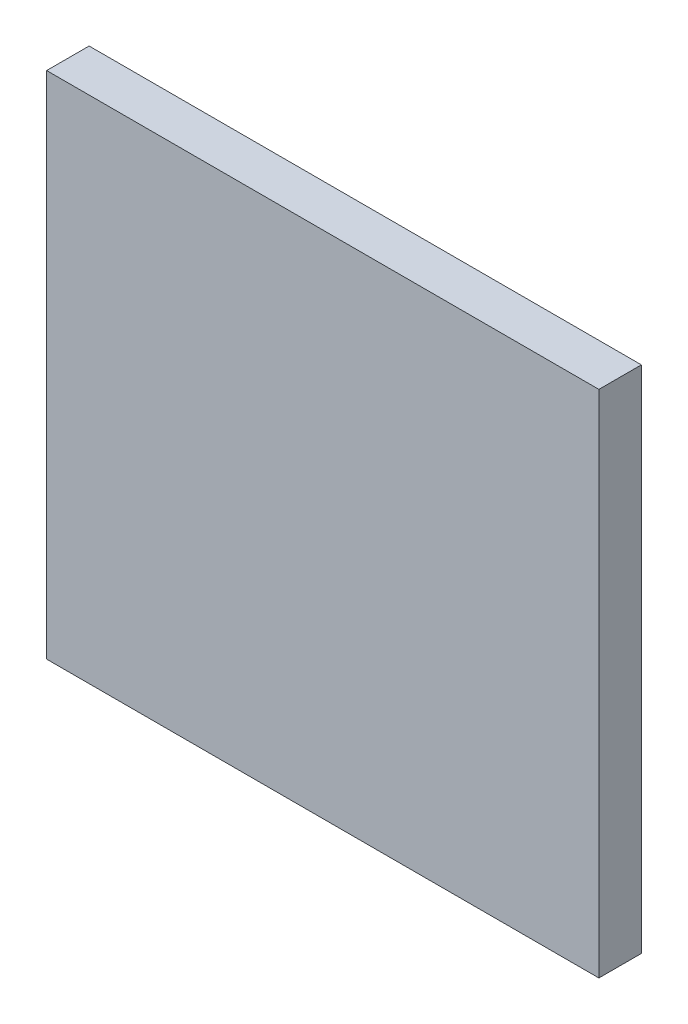
ISO-10303-21;
HEADER;
FILE_DESCRIPTION(('STEP AP214'),'2;1');
FILE_NAME('part.step','',(''),(''),'','','');
FILE_SCHEMA(('AUTOMOTIVE_DESIGN { 1 0 10303 214 1 1 1 1 }'));
ENDSEC;
DATA;
#1=APPLICATION_CONTEXT('core data for automotive mechanical design processes');
#2=APPLICATION_PROTOCOL_DEFINITION('international standard','automotive_design',2000,#1);
#3=PRODUCT_CONTEXT('',#1,'mechanical');
#4=PRODUCT('Part','Part','',(#3));
#5=PRODUCT_RELATED_PRODUCT_CATEGORY('part','',(#4));
#6=PRODUCT_DEFINITION_FORMATION('','',#4);
#7=PRODUCT_DEFINITION_CONTEXT('part definition',#1,'design');
#8=PRODUCT_DEFINITION('design','',#6,#7);
#9=PRODUCT_DEFINITION_SHAPE('','',#8);
#10=(LENGTH_UNIT() NAMED_UNIT(*) SI_UNIT(.MILLI.,.METRE.));
#11=(NAMED_UNIT(*) PLANE_ANGLE_UNIT() SI_UNIT($,.RADIAN.));
#12=(NAMED_UNIT(*) SI_UNIT($,.STERADIAN.) SOLID_ANGLE_UNIT());
#13=UNCERTAINTY_MEASURE_WITH_UNIT(LENGTH_MEASURE(1.E-05),#10,'distance_accuracy_value','');
#14=(GEOMETRIC_REPRESENTATION_CONTEXT(3) GLOBAL_UNCERTAINTY_ASSIGNED_CONTEXT((#13)) GLOBAL_UNIT_ASSIGNED_CONTEXT((#10,
#11,#12)) REPRESENTATION_CONTEXT('',''));
#15=CARTESIAN_POINT('',(0.,0.,0.));
#16=DIRECTION('',(0.,0.,1.));
#17=DIRECTION('',(1.,0.,0.));
#18=AXIS2_PLACEMENT_3D('',#15,#16,#17);
#19=CARTESIAN_POINT('',(-0.65,1.05,0.));
#20=DIRECTION('',(1.,0.,0.));
#21=DIRECTION('',(0.,0.,1.));
#22=AXIS2_PLACEMENT_3D('',#19,#20,#21);
#23=PLANE('',#22);
#24=DIRECTION('',(0.,1.,0.));
#25=VECTOR('',#24,1.);
#26=CARTESIAN_POINT('',(-0.65,1.05,0.1));
#27=LINE('',#26,#25);
#28=CARTESIAN_POINT('',(-0.65,1.05,0.1));
#29=VERTEX_POINT('',#28);
#30=CARTESIAN_POINT('',(-0.65,2.25,0.1));
#31=VERTEX_POINT('',#30);
#32=EDGE_CURVE('E11',#29,#31,#27,.T.);
#33=ORIENTED_EDGE('',*,*,#32,.T.);
#34=DIRECTION('',(0.,0.,1.));
#35=VECTOR('',#34,1.);
#36=CARTESIAN_POINT('',(-0.65,2.25,0.));
#37=LINE('',#36,#35);
#38=CARTESIAN_POINT('',(-0.65,2.25,0.));
#39=VERTEX_POINT('',#38);
#40=EDGE_CURVE('E23',#39,#31,#37,.T.);
#41=ORIENTED_EDGE('',*,*,#40,.F.);
#42=DIRECTION('',(0.,1.,0.));
#43=VECTOR('',#42,1.);
#44=CARTESIAN_POINT('',(-0.65,1.05,0.));
#45=LINE('',#44,#43);
#46=CARTESIAN_POINT('',(-0.65,1.05,0.));
#47=VERTEX_POINT('',#46);
#48=EDGE_CURVE('E85',#47,#39,#45,.T.);
#49=ORIENTED_EDGE('',*,*,#48,.F.);
#50=DIRECTION('',(0.,0.,1.));
#51=VECTOR('',#50,1.);
#52=CARTESIAN_POINT('',(-0.65,1.05,0.));
#53=LINE('',#52,#51);
#54=EDGE_CURVE('E35',#47,#29,#53,.T.);
#55=ORIENTED_EDGE('',*,*,#54,.T.);
#56=EDGE_LOOP('',(#33,#41,#49,#55));
#57=FACE_BOUND('',#56,.T.);
#58=ADVANCED_FACE('F16',(#57),#23,.F.);
#59=CARTESIAN_POINT('',(0.65,1.05,0.));
#60=DIRECTION('',(1.,0.,0.));
#61=DIRECTION('',(0.,0.,1.));
#62=AXIS2_PLACEMENT_3D('',#59,#60,#61);
#63=PLANE('',#62);
#64=DIRECTION('',(0.,0.,1.));
#65=VECTOR('',#64,1.);
#66=CARTESIAN_POINT('',(0.65,1.05,0.));
#67=LINE('',#66,#65);
#68=CARTESIAN_POINT('',(0.65,1.05,0.));
#69=VERTEX_POINT('',#68);
#70=CARTESIAN_POINT('',(0.65,1.05,0.1));
#71=VERTEX_POINT('',#70);
#72=EDGE_CURVE('E82',#69,#71,#67,.T.);
#73=ORIENTED_EDGE('',*,*,#72,.F.);
#74=DIRECTION('',(0.,1.,0.));
#75=VECTOR('',#74,1.);
#76=CARTESIAN_POINT('',(0.65,1.05,0.));
#77=LINE('',#76,#75);
#78=CARTESIAN_POINT('',(0.65,2.25,0.));
#79=VERTEX_POINT('',#78);
#80=EDGE_CURVE('E62',#69,#79,#77,.T.);
#81=ORIENTED_EDGE('',*,*,#80,.T.);
#82=DIRECTION('',(0.,0.,1.));
#83=VECTOR('',#82,1.);
#84=CARTESIAN_POINT('',(0.65,2.25,0.));
#85=LINE('',#84,#83);
#86=CARTESIAN_POINT('',(0.65,2.25,0.1));
#87=VERTEX_POINT('',#86);
#88=EDGE_CURVE('E56',#79,#87,#85,.T.);
#89=ORIENTED_EDGE('',*,*,#88,.T.);
#90=DIRECTION('',(0.,1.,0.));
#91=VECTOR('',#90,1.);
#92=CARTESIAN_POINT('',(0.65,1.05,0.1));
#93=LINE('',#92,#91);
#94=EDGE_CURVE('E59',#71,#87,#93,.T.);
#95=ORIENTED_EDGE('',*,*,#94,.F.);
#96=EDGE_LOOP('',(#73,#81,#89,#95));
#97=FACE_BOUND('',#96,.T.);
#98=ADVANCED_FACE('F58',(#97),#63,.T.);
#99=CARTESIAN_POINT('',(-0.65,1.05,0.));
#100=DIRECTION('',(0.,1.,0.));
#101=DIRECTION('',(0.,0.,1.));
#102=AXIS2_PLACEMENT_3D('',#99,#100,#101);
#103=PLANE('',#102);
#104=ORIENTED_EDGE('',*,*,#72,.T.);
#105=DIRECTION('',(1.,0.,0.));
#106=VECTOR('',#105,1.);
#107=CARTESIAN_POINT('',(-0.65,1.05,0.1));
#108=LINE('',#107,#106);
#109=EDGE_CURVE('E70',#29,#71,#108,.T.);
#110=ORIENTED_EDGE('',*,*,#109,.F.);
#111=ORIENTED_EDGE('',*,*,#54,.F.);
#112=DIRECTION('',(1.,0.,0.));
#113=VECTOR('',#112,1.);
#114=CARTESIAN_POINT('',(-0.65,1.05,0.));
#115=LINE('',#114,#113);
#116=EDGE_CURVE('E75',#47,#69,#115,.T.);
#117=ORIENTED_EDGE('',*,*,#116,.T.);
#118=EDGE_LOOP('',(#104,#110,#111,#117));
#119=FACE_BOUND('',#118,.T.);
#120=ADVANCED_FACE('F90',(#119),#103,.F.);
#121=CARTESIAN_POINT('',(-0.65,2.25,0.));
#122=DIRECTION('',(0.,1.,0.));
#123=DIRECTION('',(0.,0.,1.));
#124=AXIS2_PLACEMENT_3D('',#121,#122,#123);
#125=PLANE('',#124);
#126=DIRECTION('',(1.,0.,0.));
#127=VECTOR('',#126,1.);
#128=CARTESIAN_POINT('',(-0.65,2.25,0.));
#129=LINE('',#128,#127);
#130=EDGE_CURVE('E73',#39,#79,#129,.T.);
#131=ORIENTED_EDGE('',*,*,#130,.F.);
#132=ORIENTED_EDGE('',*,*,#40,.T.);
#133=DIRECTION('',(1.,0.,0.));
#134=VECTOR('',#133,1.);
#135=CARTESIAN_POINT('',(-0.65,2.25,0.1));
#136=LINE('',#135,#134);
#137=EDGE_CURVE('E68',#31,#87,#136,.T.);
#138=ORIENTED_EDGE('',*,*,#137,.T.);
#139=ORIENTED_EDGE('',*,*,#88,.F.);
#140=EDGE_LOOP('',(#131,#132,#138,#139));
#141=FACE_BOUND('',#140,.T.);
#142=ADVANCED_FACE('F72',(#141),#125,.T.);
#143=CARTESIAN_POINT('',(-0.65,1.05,0.));
#144=DIRECTION('',(0.,0.,1.));
#145=DIRECTION('',(1.,0.,0.));
#146=AXIS2_PLACEMENT_3D('',#143,#144,#145);
#147=PLANE('',#146);
#148=ORIENTED_EDGE('',*,*,#130,.T.);
#149=ORIENTED_EDGE('',*,*,#80,.F.);
#150=ORIENTED_EDGE('',*,*,#116,.F.);
#151=ORIENTED_EDGE('',*,*,#48,.T.);
#152=EDGE_LOOP('',(#148,#149,#150,#151));
#153=FACE_BOUND('',#152,.T.);
#154=ADVANCED_FACE('F88',(#153),#147,.F.);
#155=CARTESIAN_POINT('',(-0.65,1.05,0.1));
#156=DIRECTION('',(0.,0.,1.));
#157=DIRECTION('',(1.,0.,0.));
#158=AXIS2_PLACEMENT_3D('',#155,#156,#157);
#159=PLANE('',#158);
#160=ORIENTED_EDGE('',*,*,#32,.F.);
#161=ORIENTED_EDGE('',*,*,#109,.T.);
#162=ORIENTED_EDGE('',*,*,#94,.T.);
#163=ORIENTED_EDGE('',*,*,#137,.F.);
#164=EDGE_LOOP('',(#160,#161,#162,#163));
#165=FACE_BOUND('',#164,.T.);
#166=ADVANCED_FACE('F67',(#165),#159,.T.);
#167=CLOSED_SHELL('',(#58,#98,#120,#142,#154,#166));
#168=MANIFOLD_SOLID_BREP('B1',#167);
#169=ADVANCED_BREP_SHAPE_REPRESENTATION('',(#18,#168),#14);
#170=SHAPE_DEFINITION_REPRESENTATION(#9,#169);
ENDSEC;
END-ISO-10303-21;
